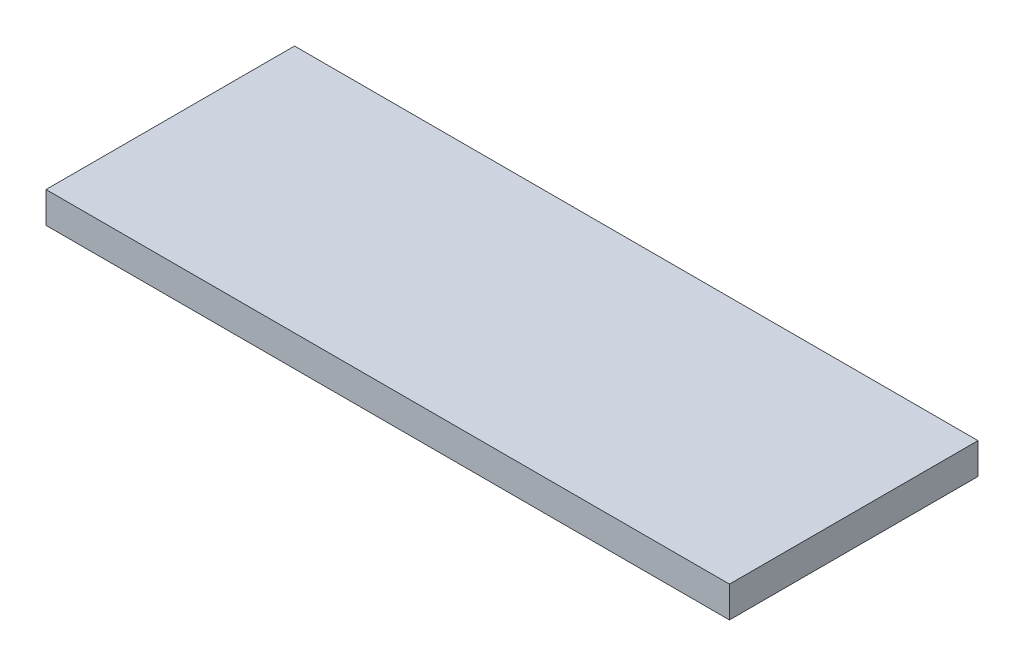
ISO-10303-21;
HEADER;
FILE_DESCRIPTION(('STEP AP214'),'2;1');
FILE_NAME('part.step','',(''),(''),'','','');
FILE_SCHEMA(('AUTOMOTIVE_DESIGN { 1 0 10303 214 1 1 1 1 }'));
ENDSEC;
DATA;
#1=APPLICATION_CONTEXT('core data for automotive mechanical design processes');
#2=APPLICATION_PROTOCOL_DEFINITION('international standard','automotive_design',2000,#1);
#3=PRODUCT_CONTEXT('',#1,'mechanical');
#4=PRODUCT('Part','Part','',(#3));
#5=PRODUCT_RELATED_PRODUCT_CATEGORY('part','',(#4));
#6=PRODUCT_DEFINITION_FORMATION('','',#4);
#7=PRODUCT_DEFINITION_CONTEXT('part definition',#1,'design');
#8=PRODUCT_DEFINITION('design','',#6,#7);
#9=PRODUCT_DEFINITION_SHAPE('','',#8);
#10=(LENGTH_UNIT() NAMED_UNIT(*) SI_UNIT(.MILLI.,.METRE.));
#11=(NAMED_UNIT(*) PLANE_ANGLE_UNIT() SI_UNIT($,.RADIAN.));
#12=(NAMED_UNIT(*) SI_UNIT($,.STERADIAN.) SOLID_ANGLE_UNIT());
#13=UNCERTAINTY_MEASURE_WITH_UNIT(LENGTH_MEASURE(1.E-05),#10,'distance_accuracy_value','');
#14=(GEOMETRIC_REPRESENTATION_CONTEXT(3) GLOBAL_UNCERTAINTY_ASSIGNED_CONTEXT((#13)) GLOBAL_UNIT_ASSIGNED_CONTEXT((#10,
#11,#12)) REPRESENTATION_CONTEXT('',''));
#15=CARTESIAN_POINT('',(0.,0.,0.));
#16=DIRECTION('',(0.,0.,1.));
#17=DIRECTION('',(1.,0.,0.));
#18=AXIS2_PLACEMENT_3D('',#15,#16,#17);
#19=CARTESIAN_POINT('',(0.,1.,0.));
#20=DIRECTION('',(1.,0.,0.));
#21=DIRECTION('',(0.,0.,-1.));
#22=AXIS2_PLACEMENT_3D('',#19,#20,#21);
#23=PLANE('',#22);
#24=DIRECTION('',(0.,0.,1.));
#25=VECTOR('',#24,1.);
#26=CARTESIAN_POINT('',(0.,0.,0.));
#27=LINE('',#26,#25);
#28=CARTESIAN_POINT('',(0.,0.,-8.));
#29=VERTEX_POINT('',#28);
#30=CARTESIAN_POINT('',(0.,0.,0.));
#31=VERTEX_POINT('',#30);
#32=EDGE_CURVE('E96',#29,#31,#27,.T.);
#33=ORIENTED_EDGE('',*,*,#32,.T.);
#34=DIRECTION('',(0.,-1.,0.));
#35=VECTOR('',#34,1.);
#36=CARTESIAN_POINT('',(0.,1.,0.));
#37=LINE('',#36,#35);
#38=CARTESIAN_POINT('',(0.,1.,0.));
#39=VERTEX_POINT('',#38);
#40=EDGE_CURVE('E11',#39,#31,#37,.T.);
#41=ORIENTED_EDGE('',*,*,#40,.F.);
#42=DIRECTION('',(0.,0.,1.));
#43=VECTOR('',#42,1.);
#44=CARTESIAN_POINT('',(0.,1.,0.));
#45=LINE('',#44,#43);
#46=CARTESIAN_POINT('',(0.,1.,-8.));
#47=VERTEX_POINT('',#46);
#48=EDGE_CURVE('E84',#47,#39,#45,.T.);
#49=ORIENTED_EDGE('',*,*,#48,.F.);
#50=DIRECTION('',(0.,-1.,0.));
#51=VECTOR('',#50,1.);
#52=CARTESIAN_POINT('',(0.,1.,-8.));
#53=LINE('',#52,#51);
#54=EDGE_CURVE('E92',#47,#29,#53,.T.);
#55=ORIENTED_EDGE('',*,*,#54,.T.);
#56=EDGE_LOOP('',(#33,#41,#49,#55));
#57=FACE_BOUND('',#56,.T.);
#58=ADVANCED_FACE('F33',(#57),#23,.F.);
#59=CARTESIAN_POINT('',(0.,1.,0.));
#60=DIRECTION('',(0.,0.,-1.));
#61=DIRECTION('',(-1.,0.,0.));
#62=AXIS2_PLACEMENT_3D('',#59,#60,#61);
#63=PLANE('',#62);
#64=DIRECTION('',(1.,0.,0.));
#65=VECTOR('',#64,1.);
#66=CARTESIAN_POINT('',(0.,0.,0.));
#67=LINE('',#66,#65);
#68=CARTESIAN_POINT('',(22.,0.,0.));
#69=VERTEX_POINT('',#68);
#70=EDGE_CURVE('E88',#31,#69,#67,.T.);
#71=ORIENTED_EDGE('',*,*,#70,.T.);
#72=DIRECTION('',(0.,-1.,0.));
#73=VECTOR('',#72,1.);
#74=CARTESIAN_POINT('',(22.,1.,0.));
#75=LINE('',#74,#73);
#76=CARTESIAN_POINT('',(22.,1.,0.));
#77=VERTEX_POINT('',#76);
#78=EDGE_CURVE('E41',#77,#69,#75,.T.);
#79=ORIENTED_EDGE('',*,*,#78,.F.);
#80=DIRECTION('',(1.,0.,0.));
#81=VECTOR('',#80,1.);
#82=CARTESIAN_POINT('',(0.,1.,0.));
#83=LINE('',#82,#81);
#84=EDGE_CURVE('E79',#39,#77,#83,.T.);
#85=ORIENTED_EDGE('',*,*,#84,.F.);
#86=ORIENTED_EDGE('',*,*,#40,.T.);
#87=EDGE_LOOP('',(#71,#79,#85,#86));
#88=FACE_BOUND('',#87,.T.);
#89=ADVANCED_FACE('F87',(#88),#63,.F.);
#90=CARTESIAN_POINT('',(22.,1.,0.));
#91=DIRECTION('',(-1.,0.,0.));
#92=DIRECTION('',(0.,0.,1.));
#93=AXIS2_PLACEMENT_3D('',#90,#91,#92);
#94=PLANE('',#93);
#95=DIRECTION('',(0.,0.,-1.));
#96=VECTOR('',#95,1.);
#97=CARTESIAN_POINT('',(22.,0.,0.));
#98=LINE('',#97,#96);
#99=CARTESIAN_POINT('',(22.,0.,-8.));
#100=VERTEX_POINT('',#99);
#101=EDGE_CURVE('E66',#69,#100,#98,.T.);
#102=ORIENTED_EDGE('',*,*,#101,.T.);
#103=DIRECTION('',(0.,-1.,0.));
#104=VECTOR('',#103,1.);
#105=CARTESIAN_POINT('',(22.,1.,-8.));
#106=LINE('',#105,#104);
#107=CARTESIAN_POINT('',(22.,1.,-8.));
#108=VERTEX_POINT('',#107);
#109=EDGE_CURVE('E89',#108,#100,#106,.T.);
#110=ORIENTED_EDGE('',*,*,#109,.F.);
#111=DIRECTION('',(0.,0.,-1.));
#112=VECTOR('',#111,1.);
#113=CARTESIAN_POINT('',(22.,1.,0.));
#114=LINE('',#113,#112);
#115=EDGE_CURVE('E82',#77,#108,#114,.T.);
#116=ORIENTED_EDGE('',*,*,#115,.F.);
#117=ORIENTED_EDGE('',*,*,#78,.T.);
#118=EDGE_LOOP('',(#102,#110,#116,#117));
#119=FACE_BOUND('',#118,.T.);
#120=ADVANCED_FACE('F90',(#119),#94,.F.);
#121=CARTESIAN_POINT('',(0.,1.,-8.));
#122=DIRECTION('',(0.,0.,1.));
#123=DIRECTION('',(1.,0.,0.));
#124=AXIS2_PLACEMENT_3D('',#121,#122,#123);
#125=PLANE('',#124);
#126=DIRECTION('',(-1.,0.,0.));
#127=VECTOR('',#126,1.);
#128=CARTESIAN_POINT('',(0.,0.,-8.));
#129=LINE('',#128,#127);
#130=EDGE_CURVE('E72',#100,#29,#129,.T.);
#131=ORIENTED_EDGE('',*,*,#130,.T.);
#132=ORIENTED_EDGE('',*,*,#54,.F.);
#133=DIRECTION('',(-1.,0.,0.));
#134=VECTOR('',#133,1.);
#135=CARTESIAN_POINT('',(0.,1.,-8.));
#136=LINE('',#135,#134);
#137=EDGE_CURVE('E49',#108,#47,#136,.T.);
#138=ORIENTED_EDGE('',*,*,#137,.F.);
#139=ORIENTED_EDGE('',*,*,#109,.T.);
#140=EDGE_LOOP('',(#131,#132,#138,#139));
#141=FACE_BOUND('',#140,.T.);
#142=ADVANCED_FACE('F103',(#141),#125,.F.);
#143=CARTESIAN_POINT('',(0.,1.,0.));
#144=DIRECTION('',(0.,-1.,0.));
#145=DIRECTION('',(0.,0.,-1.));
#146=AXIS2_PLACEMENT_3D('',#143,#144,#145);
#147=PLANE('',#146);
#148=ORIENTED_EDGE('',*,*,#48,.T.);
#149=ORIENTED_EDGE('',*,*,#84,.T.);
#150=ORIENTED_EDGE('',*,*,#115,.T.);
#151=ORIENTED_EDGE('',*,*,#137,.T.);
#152=EDGE_LOOP('',(#148,#149,#150,#151));
#153=FACE_BOUND('',#152,.T.);
#154=ADVANCED_FACE('F80',(#153),#147,.F.);
#155=CARTESIAN_POINT('',(0.,0.,0.));
#156=DIRECTION('',(0.,-1.,0.));
#157=DIRECTION('',(0.,0.,-1.));
#158=AXIS2_PLACEMENT_3D('',#155,#156,#157);
#159=PLANE('',#158);
#160=ORIENTED_EDGE('',*,*,#32,.F.);
#161=ORIENTED_EDGE('',*,*,#130,.F.);
#162=ORIENTED_EDGE('',*,*,#101,.F.);
#163=ORIENTED_EDGE('',*,*,#70,.F.);
#164=EDGE_LOOP('',(#160,#161,#162,#163));
#165=FACE_BOUND('',#164,.T.);
#166=ADVANCED_FACE('F106',(#165),#159,.T.);
#167=CLOSED_SHELL('',(#58,#89,#120,#142,#154,#166));
#168=MANIFOLD_SOLID_BREP('B2',#167);
#169=ADVANCED_BREP_SHAPE_REPRESENTATION('',(#18,#168),#14);
#170=SHAPE_DEFINITION_REPRESENTATION(#9,#169);
ENDSEC;
END-ISO-10303-21;
